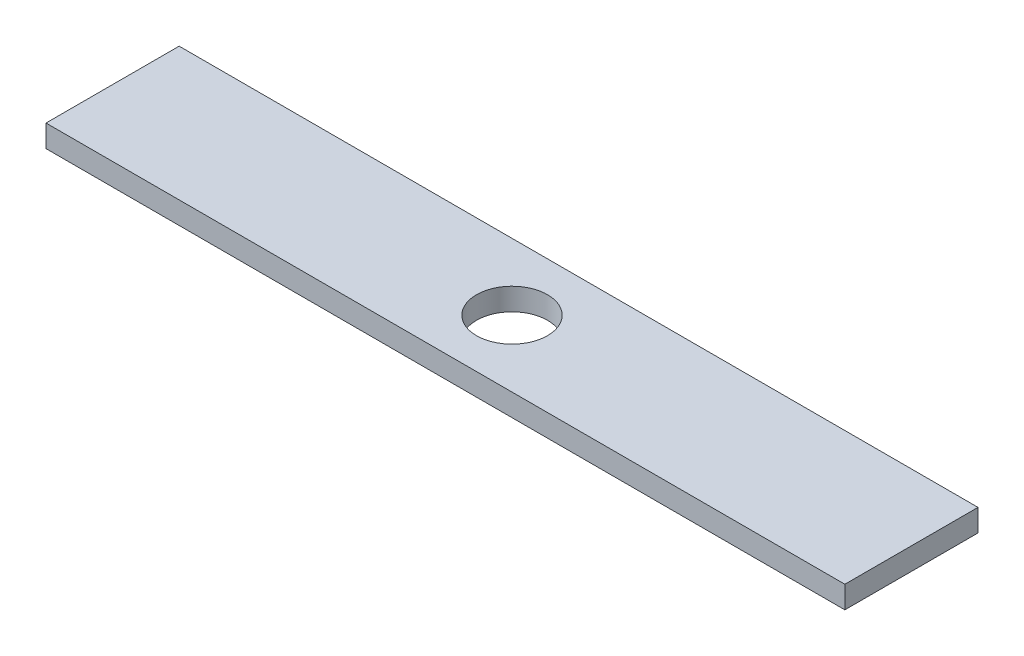
ISO-10303-21;
HEADER;
FILE_DESCRIPTION(('STEP AP214'),'2;1');
FILE_NAME('part.step','',(''),(''),'','','');
FILE_SCHEMA(('AUTOMOTIVE_DESIGN { 1 0 10303 214 1 1 1 1 }'));
ENDSEC;
DATA;
#1=APPLICATION_CONTEXT('core data for automotive mechanical design processes');
#2=APPLICATION_PROTOCOL_DEFINITION('international standard','automotive_design',2000,#1);
#3=PRODUCT_CONTEXT('',#1,'mechanical');
#4=PRODUCT('Part','Part','',(#3));
#5=PRODUCT_RELATED_PRODUCT_CATEGORY('part','',(#4));
#6=PRODUCT_DEFINITION_FORMATION('','',#4);
#7=PRODUCT_DEFINITION_CONTEXT('part definition',#1,'design');
#8=PRODUCT_DEFINITION('design','',#6,#7);
#9=PRODUCT_DEFINITION_SHAPE('','',#8);
#10=(LENGTH_UNIT() NAMED_UNIT(*) SI_UNIT(.MILLI.,.METRE.));
#11=(NAMED_UNIT(*) PLANE_ANGLE_UNIT() SI_UNIT($,.RADIAN.));
#12=(NAMED_UNIT(*) SI_UNIT($,.STERADIAN.) SOLID_ANGLE_UNIT());
#13=UNCERTAINTY_MEASURE_WITH_UNIT(LENGTH_MEASURE(1.E-05),#10,'distance_accuracy_value','');
#14=(GEOMETRIC_REPRESENTATION_CONTEXT(3) GLOBAL_UNCERTAINTY_ASSIGNED_CONTEXT((#13)) GLOBAL_UNIT_ASSIGNED_CONTEXT((#10,
#11,#12)) REPRESENTATION_CONTEXT('',''));
#15=CARTESIAN_POINT('',(0.,0.,0.));
#16=DIRECTION('',(0.,0.,1.));
#17=DIRECTION('',(1.,0.,0.));
#18=AXIS2_PLACEMENT_3D('',#15,#16,#17);
#19=CARTESIAN_POINT('',(90.,5.,15.));
#20=DIRECTION('',(-1.,0.,0.));
#21=DIRECTION('',(0.,0.,1.));
#22=AXIS2_PLACEMENT_3D('',#19,#20,#21);
#23=PLANE('',#22);
#24=DIRECTION('',(0.,0.,-1.));
#25=VECTOR('',#24,1.);
#26=CARTESIAN_POINT('',(90.,0.,15.));
#27=LINE('',#26,#25);
#28=CARTESIAN_POINT('',(90.,0.,15.));
#29=VERTEX_POINT('',#28);
#30=CARTESIAN_POINT('',(90.,0.,-15.));
#31=VERTEX_POINT('',#30);
#32=EDGE_CURVE('E111',#29,#31,#27,.T.);
#33=ORIENTED_EDGE('',*,*,#32,.T.);
#34=DIRECTION('',(0.,-1.,0.));
#35=VECTOR('',#34,1.);
#36=CARTESIAN_POINT('',(90.,5.,-15.));
#37=LINE('',#36,#35);
#38=CARTESIAN_POINT('',(90.,5.,-15.));
#39=VERTEX_POINT('',#38);
#40=EDGE_CURVE('E11',#39,#31,#37,.T.);
#41=ORIENTED_EDGE('',*,*,#40,.F.);
#42=DIRECTION('',(0.,0.,-1.));
#43=VECTOR('',#42,1.);
#44=CARTESIAN_POINT('',(90.,5.,15.));
#45=LINE('',#44,#43);
#46=CARTESIAN_POINT('',(90.,5.,15.));
#47=VERTEX_POINT('',#46);
#48=EDGE_CURVE('E95',#47,#39,#45,.T.);
#49=ORIENTED_EDGE('',*,*,#48,.F.);
#50=DIRECTION('',(0.,-1.,0.));
#51=VECTOR('',#50,1.);
#52=CARTESIAN_POINT('',(90.,5.,15.));
#53=LINE('',#52,#51);
#54=EDGE_CURVE('E107',#47,#29,#53,.T.);
#55=ORIENTED_EDGE('',*,*,#54,.T.);
#56=EDGE_LOOP('',(#33,#41,#49,#55));
#57=FACE_BOUND('',#56,.T.);
#58=ADVANCED_FACE('F43',(#57),#23,.F.);
#59=CARTESIAN_POINT('',(-90.,5.,-15.));
#60=DIRECTION('',(0.,0.,1.));
#61=DIRECTION('',(1.,0.,0.));
#62=AXIS2_PLACEMENT_3D('',#59,#60,#61);
#63=PLANE('',#62);
#64=DIRECTION('',(-1.,0.,0.));
#65=VECTOR('',#64,1.);
#66=CARTESIAN_POINT('',(-90.,0.,-15.));
#67=LINE('',#66,#65);
#68=CARTESIAN_POINT('',(-90.,0.,-15.));
#69=VERTEX_POINT('',#68);
#70=EDGE_CURVE('E100',#31,#69,#67,.T.);
#71=ORIENTED_EDGE('',*,*,#70,.T.);
#72=DIRECTION('',(0.,-1.,0.));
#73=VECTOR('',#72,1.);
#74=CARTESIAN_POINT('',(-90.,5.,-15.));
#75=LINE('',#74,#73);
#76=CARTESIAN_POINT('',(-90.,5.,-15.));
#77=VERTEX_POINT('',#76);
#78=EDGE_CURVE('E52',#77,#69,#75,.T.);
#79=ORIENTED_EDGE('',*,*,#78,.F.);
#80=DIRECTION('',(-1.,0.,0.));
#81=VECTOR('',#80,1.);
#82=CARTESIAN_POINT('',(-90.,5.,-15.));
#83=LINE('',#82,#81);
#84=EDGE_CURVE('E90',#39,#77,#83,.T.);
#85=ORIENTED_EDGE('',*,*,#84,.F.);
#86=ORIENTED_EDGE('',*,*,#40,.T.);
#87=EDGE_LOOP('',(#71,#79,#85,#86));
#88=FACE_BOUND('',#87,.T.);
#89=ADVANCED_FACE('F99',(#88),#63,.F.);
#90=CARTESIAN_POINT('',(-90.,5.,15.));
#91=DIRECTION('',(1.,0.,0.));
#92=DIRECTION('',(0.,0.,-1.));
#93=AXIS2_PLACEMENT_3D('',#90,#91,#92);
#94=PLANE('',#93);
#95=DIRECTION('',(0.,0.,1.));
#96=VECTOR('',#95,1.);
#97=CARTESIAN_POINT('',(-90.,0.,15.));
#98=LINE('',#97,#96);
#99=CARTESIAN_POINT('',(-90.,0.,15.));
#100=VERTEX_POINT('',#99);
#101=EDGE_CURVE('E77',#69,#100,#98,.T.);
#102=ORIENTED_EDGE('',*,*,#101,.T.);
#103=DIRECTION('',(0.,-1.,0.));
#104=VECTOR('',#103,1.);
#105=CARTESIAN_POINT('',(-90.,5.,15.));
#106=LINE('',#105,#104);
#107=CARTESIAN_POINT('',(-90.,5.,15.));
#108=VERTEX_POINT('',#107);
#109=EDGE_CURVE('E102',#108,#100,#106,.T.);
#110=ORIENTED_EDGE('',*,*,#109,.F.);
#111=DIRECTION('',(0.,0.,1.));
#112=VECTOR('',#111,1.);
#113=CARTESIAN_POINT('',(-90.,5.,15.));
#114=LINE('',#113,#112);
#115=EDGE_CURVE('E93',#77,#108,#114,.T.);
#116=ORIENTED_EDGE('',*,*,#115,.F.);
#117=ORIENTED_EDGE('',*,*,#78,.T.);
#118=EDGE_LOOP('',(#102,#110,#116,#117));
#119=FACE_BOUND('',#118,.T.);
#120=ADVANCED_FACE('F103',(#119),#94,.F.);
#121=CARTESIAN_POINT('',(-90.,5.,15.));
#122=DIRECTION('',(0.,0.,-1.));
#123=DIRECTION('',(-1.,0.,0.));
#124=AXIS2_PLACEMENT_3D('',#121,#122,#123);
#125=PLANE('',#124);
#126=DIRECTION('',(1.,0.,0.));
#127=VECTOR('',#126,1.);
#128=CARTESIAN_POINT('',(-90.,0.,15.));
#129=LINE('',#128,#127);
#130=EDGE_CURVE('E83',#100,#29,#129,.T.);
#131=ORIENTED_EDGE('',*,*,#130,.T.);
#132=ORIENTED_EDGE('',*,*,#54,.F.);
#133=DIRECTION('',(1.,0.,0.));
#134=VECTOR('',#133,1.);
#135=CARTESIAN_POINT('',(-90.,5.,15.));
#136=LINE('',#135,#134);
#137=EDGE_CURVE('E60',#108,#47,#136,.T.);
#138=ORIENTED_EDGE('',*,*,#137,.F.);
#139=ORIENTED_EDGE('',*,*,#109,.T.);
#140=EDGE_LOOP('',(#131,#132,#138,#139));
#141=FACE_BOUND('',#140,.T.);
#142=ADVANCED_FACE('F125',(#141),#125,.F.);
#143=CARTESIAN_POINT('',(0.,5.,0.));
#144=DIRECTION('',(0.,-1.,0.));
#145=DIRECTION('',(0.,0.,-1.));
#146=AXIS2_PLACEMENT_3D('',#143,#144,#145);
#147=PLANE('',#146);
#148=CARTESIAN_POINT('',(0.,5.,0.));
#149=DIRECTION('',(0.,1.,0.));
#150=DIRECTION('',(0.,0.,1.));
#151=AXIS2_PLACEMENT_3D('',#148,#149,#150);
#152=CIRCLE('',#151,8.);
#153=CARTESIAN_POINT('',(0.,5.,8.));
#154=VERTEX_POINT('',#153);
#155=EDGE_CURVE('E132',#154,#154,#152,.T.);
#156=ORIENTED_EDGE('',*,*,#155,.F.);
#157=EDGE_LOOP('',(#156));
#158=FACE_BOUND('',#157,.T.);
#159=ORIENTED_EDGE('',*,*,#48,.T.);
#160=ORIENTED_EDGE('',*,*,#84,.T.);
#161=ORIENTED_EDGE('',*,*,#115,.T.);
#162=ORIENTED_EDGE('',*,*,#137,.T.);
#163=EDGE_LOOP('',(#159,#160,#161,#162));
#164=FACE_BOUND('',#163,.T.);
#165=ADVANCED_FACE('F91',(#158,#164),#147,.F.);
#166=CARTESIAN_POINT('',(0.,0.,0.));
#167=DIRECTION('',(0.,-1.,0.));
#168=DIRECTION('',(0.,0.,-1.));
#169=AXIS2_PLACEMENT_3D('',#166,#167,#168);
#170=PLANE('',#169);
#171=CARTESIAN_POINT('',(0.,0.,0.));
#172=DIRECTION('',(0.,1.,0.));
#173=DIRECTION('',(0.,0.,1.));
#174=AXIS2_PLACEMENT_3D('',#171,#172,#173);
#175=CIRCLE('',#174,8.);
#176=CARTESIAN_POINT('',(0.,0.,8.));
#177=VERTEX_POINT('',#176);
#178=EDGE_CURVE('E115',#177,#177,#175,.T.);
#179=ORIENTED_EDGE('',*,*,#178,.T.);
#180=EDGE_LOOP('',(#179));
#181=FACE_BOUND('',#180,.T.);
#182=ORIENTED_EDGE('',*,*,#32,.F.);
#183=ORIENTED_EDGE('',*,*,#130,.F.);
#184=ORIENTED_EDGE('',*,*,#101,.F.);
#185=ORIENTED_EDGE('',*,*,#70,.F.);
#186=EDGE_LOOP('',(#182,#183,#184,#185));
#187=FACE_BOUND('',#186,.T.);
#188=ADVANCED_FACE('F128',(#181,#187),#170,.T.);
#189=CARTESIAN_POINT('',(0.,0.,0.));
#190=DIRECTION('',(0.,1.,0.));
#191=DIRECTION('',(0.,0.,1.));
#192=AXIS2_PLACEMENT_3D('',#189,#190,#191);
#193=CYLINDRICAL_SURFACE('',#192,8.);
#194=ORIENTED_EDGE('',*,*,#178,.F.);
#195=EDGE_LOOP('',(#194));
#196=FACE_BOUND('',#195,.T.);
#197=ORIENTED_EDGE('',*,*,#155,.T.);
#198=EDGE_LOOP('',(#197));
#199=FACE_BOUND('',#198,.T.);
#200=ADVANCED_FACE('F141',(#196,#199),#193,.F.);
#201=CLOSED_SHELL('',(#58,#89,#120,#142,#165,#188,#200));
#202=MANIFOLD_SOLID_BREP('B2',#201);
#203=ADVANCED_BREP_SHAPE_REPRESENTATION('',(#18,#202),#14);
#204=SHAPE_DEFINITION_REPRESENTATION(#9,#203);
ENDSEC;
END-ISO-10303-21;
